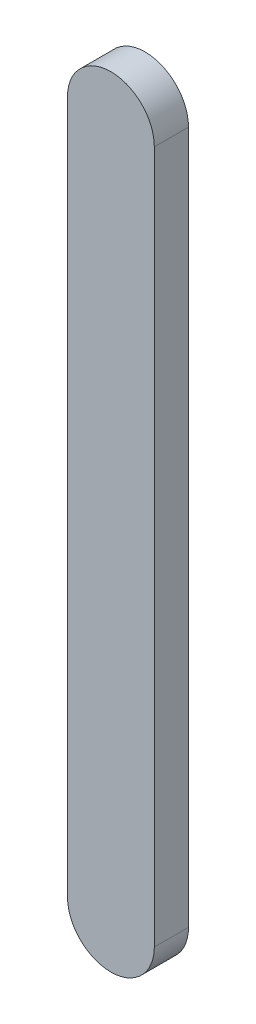
ISO-10303-21;
HEADER;
FILE_DESCRIPTION(('STEP AP214'),'2;1');
FILE_NAME('part.step','',(''),(''),'','','');
FILE_SCHEMA(('AUTOMOTIVE_DESIGN { 1 0 10303 214 1 1 1 1 }'));
ENDSEC;
DATA;
#1=APPLICATION_CONTEXT('core data for automotive mechanical design processes');
#2=APPLICATION_PROTOCOL_DEFINITION('international standard','automotive_design',2000,#1);
#3=PRODUCT_CONTEXT('',#1,'mechanical');
#4=PRODUCT('Part','Part','',(#3));
#5=PRODUCT_RELATED_PRODUCT_CATEGORY('part','',(#4));
#6=PRODUCT_DEFINITION_FORMATION('','',#4);
#7=PRODUCT_DEFINITION_CONTEXT('part definition',#1,'design');
#8=PRODUCT_DEFINITION('design','',#6,#7);
#9=PRODUCT_DEFINITION_SHAPE('','',#8);
#10=(LENGTH_UNIT() NAMED_UNIT(*) SI_UNIT(.MILLI.,.METRE.));
#11=(NAMED_UNIT(*) PLANE_ANGLE_UNIT() SI_UNIT($,.RADIAN.));
#12=(NAMED_UNIT(*) SI_UNIT($,.STERADIAN.) SOLID_ANGLE_UNIT());
#13=UNCERTAINTY_MEASURE_WITH_UNIT(LENGTH_MEASURE(1.E-05),#10,'distance_accuracy_value','');
#14=(GEOMETRIC_REPRESENTATION_CONTEXT(3) GLOBAL_UNCERTAINTY_ASSIGNED_CONTEXT((#13)) GLOBAL_UNIT_ASSIGNED_CONTEXT((#10,
#11,#12)) REPRESENTATION_CONTEXT('',''));
#15=CARTESIAN_POINT('',(0.,0.,0.));
#16=DIRECTION('',(0.,0.,1.));
#17=DIRECTION('',(1.,0.,0.));
#18=AXIS2_PLACEMENT_3D('',#15,#16,#17);
#19=CARTESIAN_POINT('',(150.749,103.05863056,0.));
#20=DIRECTION('',(-1.,0.,0.));
#21=DIRECTION('',(0.,1.,0.));
#22=AXIS2_PLACEMENT_3D('',#19,#20,#21);
#23=PLANE('',#22);
#24=DIRECTION('',(0.,1.,0.));
#25=VECTOR('',#24,1.);
#26=CARTESIAN_POINT('',(150.749,103.05863056,0.1999996));
#27=LINE('',#26,#25);
#28=CARTESIAN_POINT('',(150.749,103.05863056,0.1999996));
#29=VERTEX_POINT('',#28);
#30=CARTESIAN_POINT('',(150.749,107.1118,0.1999996));
#31=VERTEX_POINT('',#30);
#32=EDGE_CURVE('E11',#29,#31,#27,.T.);
#33=ORIENTED_EDGE('',*,*,#32,.F.);
#34=DIRECTION('',(0.,0.,1.));
#35=VECTOR('',#34,1.);
#36=CARTESIAN_POINT('',(150.749,103.05863056,0.));
#37=LINE('',#36,#35);
#38=CARTESIAN_POINT('',(150.749,103.05863056,0.));
#39=VERTEX_POINT('',#38);
#40=EDGE_CURVE('E24',#39,#29,#37,.T.);
#41=ORIENTED_EDGE('',*,*,#40,.F.);
#42=DIRECTION('',(0.,1.,0.));
#43=VECTOR('',#42,1.);
#44=CARTESIAN_POINT('',(150.749,103.05863056,0.));
#45=LINE('',#44,#43);
#46=CARTESIAN_POINT('',(150.749,107.1118,0.));
#47=VERTEX_POINT('',#46);
#48=EDGE_CURVE('E75',#39,#47,#45,.T.);
#49=ORIENTED_EDGE('',*,*,#48,.T.);
#50=DIRECTION('',(0.,0.,1.));
#51=VECTOR('',#50,1.);
#52=CARTESIAN_POINT('',(150.749,107.1118,0.));
#53=LINE('',#52,#51);
#54=EDGE_CURVE('E37',#47,#31,#53,.T.);
#55=ORIENTED_EDGE('',*,*,#54,.T.);
#56=EDGE_LOOP('',(#33,#41,#49,#55));
#57=FACE_BOUND('',#56,.T.);
#58=ADVANCED_FACE('F17',(#57),#23,.F.);
#59=CARTESIAN_POINT('',(150.495,107.1118,0.));
#60=DIRECTION('',(0.,0.,-1.));
#61=DIRECTION('',(1.,0.,0.));
#62=AXIS2_PLACEMENT_3D('',#59,#60,#61);
#63=CYLINDRICAL_SURFACE('',#62,0.253999999999995);
#64=CARTESIAN_POINT('',(150.495,107.1118,0.1999996));
#65=DIRECTION('',(0.,0.,1.));
#66=DIRECTION('',(1.,0.,0.));
#67=AXIS2_PLACEMENT_3D('',#64,#65,#66);
#68=CIRCLE('',#67,0.253999999999995);
#69=CARTESIAN_POINT('',(150.241,107.1118,0.1999996));
#70=VERTEX_POINT('',#69);
#71=EDGE_CURVE('E83',#31,#70,#68,.T.);
#72=ORIENTED_EDGE('',*,*,#71,.F.);
#73=ORIENTED_EDGE('',*,*,#54,.F.);
#74=CARTESIAN_POINT('',(150.495,107.1118,0.));
#75=DIRECTION('',(0.,0.,1.));
#76=DIRECTION('',(1.,0.,0.));
#77=AXIS2_PLACEMENT_3D('',#74,#75,#76);
#78=CIRCLE('',#77,0.253999999999995);
#79=CARTESIAN_POINT('',(150.241,107.1118,0.));
#80=VERTEX_POINT('',#79);
#81=EDGE_CURVE('E81',#47,#80,#78,.T.);
#82=ORIENTED_EDGE('',*,*,#81,.T.);
#83=DIRECTION('',(0.,0.,1.));
#84=VECTOR('',#83,1.);
#85=CARTESIAN_POINT('',(150.241,107.1118,0.));
#86=LINE('',#85,#84);
#87=EDGE_CURVE('E67',#80,#70,#86,.T.);
#88=ORIENTED_EDGE('',*,*,#87,.T.);
#89=EDGE_LOOP('',(#72,#73,#82,#88));
#90=FACE_BOUND('',#89,.T.);
#91=ADVANCED_FACE('F89',(#90),#63,.T.);
#92=CARTESIAN_POINT('',(150.241,107.1118,0.));
#93=DIRECTION('',(1.,0.,0.));
#94=DIRECTION('',(0.,-1.,0.));
#95=AXIS2_PLACEMENT_3D('',#92,#93,#94);
#96=PLANE('',#95);
#97=DIRECTION('',(0.,-1.,0.));
#98=VECTOR('',#97,1.);
#99=CARTESIAN_POINT('',(150.241,107.1118,0.1999996));
#100=LINE('',#99,#98);
#101=CARTESIAN_POINT('',(150.241,103.05863056,0.1999996));
#102=VERTEX_POINT('',#101);
#103=EDGE_CURVE('E71',#70,#102,#100,.T.);
#104=ORIENTED_EDGE('',*,*,#103,.F.);
#105=ORIENTED_EDGE('',*,*,#87,.F.);
#106=DIRECTION('',(0.,-1.,0.));
#107=VECTOR('',#106,1.);
#108=CARTESIAN_POINT('',(150.241,107.1118,0.));
#109=LINE('',#108,#107);
#110=CARTESIAN_POINT('',(150.241,103.05863056,0.));
#111=VERTEX_POINT('',#110);
#112=EDGE_CURVE('E63',#80,#111,#109,.T.);
#113=ORIENTED_EDGE('',*,*,#112,.T.);
#114=DIRECTION('',(0.,0.,1.));
#115=VECTOR('',#114,1.);
#116=CARTESIAN_POINT('',(150.241,103.05863056,0.));
#117=LINE('',#116,#115);
#118=EDGE_CURVE('E53',#111,#102,#117,.T.);
#119=ORIENTED_EDGE('',*,*,#118,.T.);
#120=EDGE_LOOP('',(#104,#105,#113,#119));
#121=FACE_BOUND('',#120,.T.);
#122=ADVANCED_FACE('F66',(#121),#96,.F.);
#123=CARTESIAN_POINT('',(150.495,103.05863056,0.));
#124=DIRECTION('',(0.,0.,-1.));
#125=DIRECTION('',(-1.,0.,0.));
#126=AXIS2_PLACEMENT_3D('',#123,#124,#125);
#127=CYLINDRICAL_SURFACE('',#126,0.254);
#128=CARTESIAN_POINT('',(150.495,103.05863056,0.1999996));
#129=DIRECTION('',(0.,0.,1.));
#130=DIRECTION('',(-1.,0.,0.));
#131=AXIS2_PLACEMENT_3D('',#128,#129,#130);
#132=CIRCLE('',#131,0.254);
#133=EDGE_CURVE('E59',#102,#29,#132,.T.);
#134=ORIENTED_EDGE('',*,*,#133,.F.);
#135=ORIENTED_EDGE('',*,*,#118,.F.);
#136=CARTESIAN_POINT('',(150.495,103.05863056,0.));
#137=DIRECTION('',(0.,0.,1.));
#138=DIRECTION('',(-1.,0.,0.));
#139=AXIS2_PLACEMENT_3D('',#136,#137,#138);
#140=CIRCLE('',#139,0.254);
#141=EDGE_CURVE('E57',#111,#39,#140,.T.);
#142=ORIENTED_EDGE('',*,*,#141,.T.);
#143=ORIENTED_EDGE('',*,*,#40,.T.);
#144=EDGE_LOOP('',(#134,#135,#142,#143));
#145=FACE_BOUND('',#144,.T.);
#146=ADVANCED_FACE('F55',(#145),#127,.T.);
#147=CARTESIAN_POINT('',(150.749,103.05863056,0.));
#148=DIRECTION('',(0.,0.,-1.));
#149=DIRECTION('',(-1.,0.,0.));
#150=AXIS2_PLACEMENT_3D('',#147,#148,#149);
#151=PLANE('',#150);
#152=ORIENTED_EDGE('',*,*,#141,.F.);
#153=ORIENTED_EDGE('',*,*,#112,.F.);
#154=ORIENTED_EDGE('',*,*,#81,.F.);
#155=ORIENTED_EDGE('',*,*,#48,.F.);
#156=EDGE_LOOP('',(#152,#153,#154,#155));
#157=FACE_BOUND('',#156,.T.);
#158=ADVANCED_FACE('F74',(#157),#151,.T.);
#159=CARTESIAN_POINT('',(150.749,103.05863056,0.1999996));
#160=DIRECTION('',(0.,0.,-1.));
#161=DIRECTION('',(-1.,0.,0.));
#162=AXIS2_PLACEMENT_3D('',#159,#160,#161);
#163=PLANE('',#162);
#164=ORIENTED_EDGE('',*,*,#32,.T.);
#165=ORIENTED_EDGE('',*,*,#71,.T.);
#166=ORIENTED_EDGE('',*,*,#103,.T.);
#167=ORIENTED_EDGE('',*,*,#133,.T.);
#168=EDGE_LOOP('',(#164,#165,#166,#167));
#169=FACE_BOUND('',#168,.T.);
#170=ADVANCED_FACE('F91',(#169),#163,.F.);
#171=CLOSED_SHELL('',(#58,#91,#122,#146,#158,#170));
#172=MANIFOLD_SOLID_BREP('B1',#171);
#173=ADVANCED_BREP_SHAPE_REPRESENTATION('',(#18,#172),#14);
#174=SHAPE_DEFINITION_REPRESENTATION(#9,#173);
ENDSEC;
END-ISO-10303-21;
